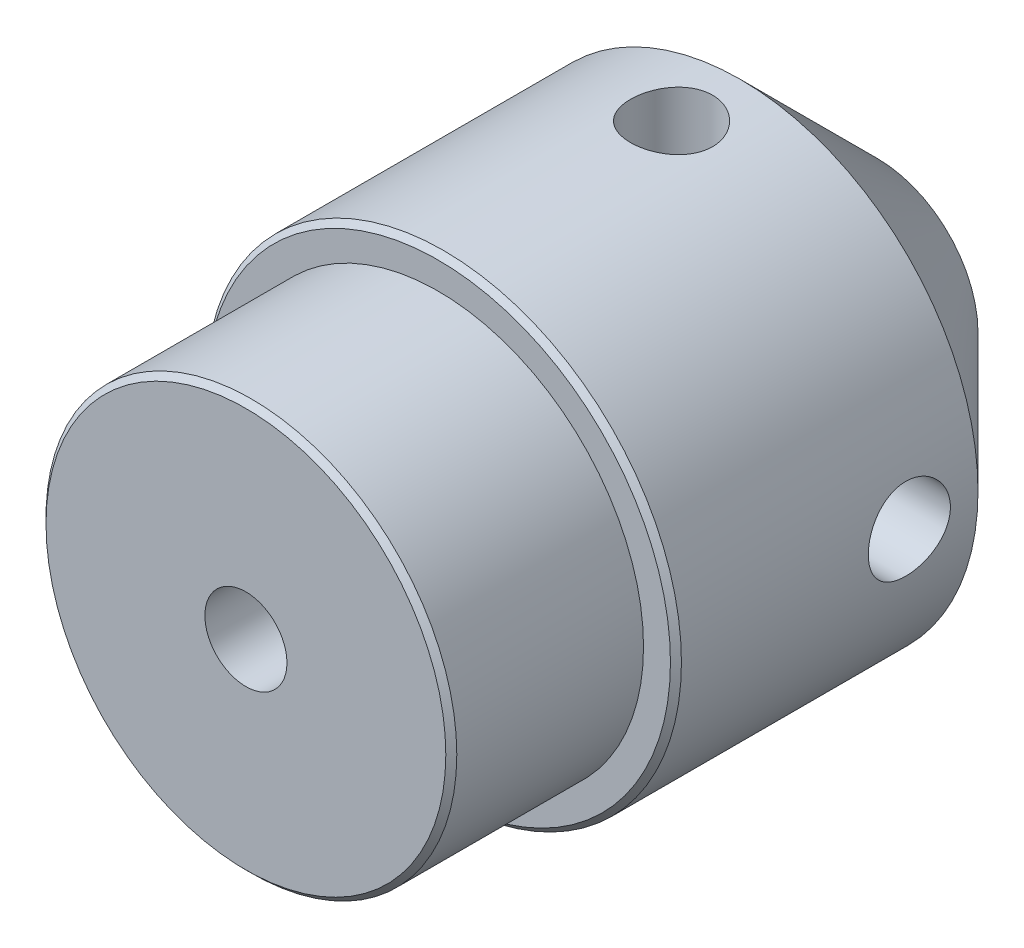
ISO-10303-21;
HEADER;
FILE_DESCRIPTION(('STEP AP214'),'2;1');
FILE_NAME('part.step','',(''),(''),'','','');
FILE_SCHEMA(('AUTOMOTIVE_DESIGN { 1 0 10303 214 1 1 1 1 }'));
ENDSEC;
DATA;
#1=APPLICATION_CONTEXT('core data for automotive mechanical design processes');
#2=APPLICATION_PROTOCOL_DEFINITION('international standard','automotive_design',2000,#1);
#3=PRODUCT_CONTEXT('',#1,'mechanical');
#4=PRODUCT('Part','Part','',(#3));
#5=PRODUCT_RELATED_PRODUCT_CATEGORY('part','',(#4));
#6=PRODUCT_DEFINITION_FORMATION('','',#4);
#7=PRODUCT_DEFINITION_CONTEXT('part definition',#1,'design');
#8=PRODUCT_DEFINITION('design','',#6,#7);
#9=PRODUCT_DEFINITION_SHAPE('','',#8);
#10=(LENGTH_UNIT() NAMED_UNIT(*) SI_UNIT(.MILLI.,.METRE.));
#11=(NAMED_UNIT(*) PLANE_ANGLE_UNIT() SI_UNIT($,.RADIAN.));
#12=(NAMED_UNIT(*) SI_UNIT($,.STERADIAN.) SOLID_ANGLE_UNIT());
#13=UNCERTAINTY_MEASURE_WITH_UNIT(LENGTH_MEASURE(1.E-05),#10,'distance_accuracy_value','');
#14=(GEOMETRIC_REPRESENTATION_CONTEXT(3) GLOBAL_UNCERTAINTY_ASSIGNED_CONTEXT((#13)) GLOBAL_UNIT_ASSIGNED_CONTEXT((#10,
#11,#12)) REPRESENTATION_CONTEXT('',''));
#15=CARTESIAN_POINT('',(0.,0.,0.));
#16=DIRECTION('',(0.,0.,1.));
#17=DIRECTION('',(1.,0.,0.));
#18=AXIS2_PLACEMENT_3D('',#15,#16,#17);
#19=CARTESIAN_POINT('',(0.,0.,20.32));
#20=DIRECTION('',(0.,0.,1.));
#21=DIRECTION('',(1.,0.,0.));
#22=AXIS2_PLACEMENT_3D('',#19,#20,#21);
#23=PLANE('',#22);
#24=CARTESIAN_POINT('',(0.,0.,20.32));
#25=DIRECTION('',(0.,0.,1.));
#26=DIRECTION('',(1.,0.,0.));
#27=AXIS2_PLACEMENT_3D('',#24,#25,#26);
#28=CIRCLE('',#27,10.746);
#29=CARTESIAN_POINT('',(10.746,0.,20.32));
#30=VERTEX_POINT('',#29);
#31=EDGE_CURVE('E39',#30,#30,#28,.T.);
#32=ORIENTED_EDGE('',*,*,#31,.T.);
#33=EDGE_LOOP('',(#32));
#34=FACE_BOUND('',#33,.T.);
#35=CARTESIAN_POINT('',(0.,0.,20.32));
#36=DIRECTION('',(0.,0.,1.));
#37=DIRECTION('',(1.,0.,0.));
#38=AXIS2_PLACEMENT_3D('',#35,#36,#37);
#39=CIRCLE('',#38,9.5);
#40=CARTESIAN_POINT('',(9.5,0.,20.32));
#41=VERTEX_POINT('',#40);
#42=EDGE_CURVE('E58',#41,#41,#39,.T.);
#43=ORIENTED_EDGE('',*,*,#42,.F.);
#44=EDGE_LOOP('',(#43));
#45=FACE_BOUND('',#44,.T.);
#46=ADVANCED_FACE('F32',(#34,#45),#23,.T.);
#47=CARTESIAN_POINT('',(0.,0.,20.32));
#48=DIRECTION('',(0.,0.,-1.));
#49=DIRECTION('',(-1.,0.,0.));
#50=AXIS2_PLACEMENT_3D('',#47,#48,#49);
#51=CYLINDRICAL_SURFACE('',#50,11.);
#52=CARTESIAN_POINT('',(11.,0.,7.62635));
#53=CARTESIAN_POINT('',(10.9999981523539,-0.105805442405319,7.62635419145079));
#54=CARTESIAN_POINT('',(10.99845757426,-0.211667228713869,7.63522415803058));
#55=CARTESIAN_POINT('',(10.9924602893102,-0.420417866640618,7.67045270552137));
#56=CARTESIAN_POINT('',(10.9880009611831,-0.523303959037818,7.69682700702448));
#57=CARTESIAN_POINT('',(10.9766659831166,-0.723053143678178,7.76624097869004));
#58=CARTESIAN_POINT('',(10.9697923668336,-0.819921224574908,7.80926662582083));
#59=CARTESIAN_POINT('',(10.9543831646584,-1.00505199771031,7.91072436106028));
#60=CARTESIAN_POINT('',(10.9458477535447,-1.09331559345729,7.96915482920385));
#61=CARTESIAN_POINT('',(10.9279624820465,-1.25964563765195,8.10039861813566));
#62=CARTESIAN_POINT('',(10.9186058827075,-1.33761136833188,8.17333867737932));
#63=CARTESIAN_POINT('',(10.9001839287852,-1.48026215108577,8.33125838424623));
#64=CARTESIAN_POINT('',(10.8911185932852,-1.54494633445972,8.41623881877474));
#65=CARTESIAN_POINT('',(10.8742402684905,-1.65960572921955,8.59652436669664));
#66=CARTESIAN_POINT('',(10.8664359825455,-1.7094805562732,8.69189420936576));
#67=CARTESIAN_POINT('',(10.8530573098417,-1.79246335200913,8.88981557628309));
#68=CARTESIAN_POINT('',(10.8474827611997,-1.82557253795546,8.99236657852992));
#69=CARTESIAN_POINT('',(10.8392620383863,-1.87376523193456,9.20066873320939));
#70=CARTESIAN_POINT('',(10.8365875540154,-1.88902312104116,9.30637840224324));
#71=CARTESIAN_POINT('',(10.8343842198333,-1.90162094158535,9.51888868799526));
#72=CARTESIAN_POINT('',(10.8348551312565,-1.89896223306347,9.62568922129192));
#73=CARTESIAN_POINT('',(10.838863553144,-1.87594419272278,9.83609970482532));
#74=CARTESIAN_POINT('',(10.8423670116831,-1.85578140368531,9.93973189953881));
#75=CARTESIAN_POINT('',(10.8519924245148,-1.7986362888669,10.1421201336787));
#76=CARTESIAN_POINT('',(10.8581144745335,-1.76165334820034,10.2408759946972));
#77=CARTESIAN_POINT('',(10.8723237297837,-1.67172041441955,10.4312929839028));
#78=CARTESIAN_POINT('',(10.8804208622865,-1.61868942511178,10.5229150867365));
#79=CARTESIAN_POINT('',(10.8976611408848,-1.49822319287714,10.6960346642193));
#80=CARTESIAN_POINT('',(10.9068043773447,-1.43078670514031,10.7775312629387));
#81=CARTESIAN_POINT('',(10.9252559375805,-1.28235594453461,10.9292235601322));
#82=CARTESIAN_POINT('',(10.9345648389951,-1.20119318034578,10.9992544243442));
#83=CARTESIAN_POINT('',(10.9521865522877,-1.02818196526628,11.1247289442071));
#84=CARTESIAN_POINT('',(10.9604993568536,-0.936333435945171,11.1801724927816));
#85=CARTESIAN_POINT('',(10.9752053448161,-0.744398317782369,11.274916062536));
#86=CARTESIAN_POINT('',(10.9815967113651,-0.644304045241601,11.3142008173418));
#87=CARTESIAN_POINT('',(10.9917252707792,-0.438803092895161,11.3753549546926));
#88=CARTESIAN_POINT('',(10.9954627019931,-0.33339689106291,11.3972259011872));
#89=CARTESIAN_POINT('',(10.999830045267,-0.121684177999061,11.4227065005));
#90=CARTESIAN_POINT('',(11.0004984408558,-0.0154056531345995,11.4265423157964));
#91=CARTESIAN_POINT('',(10.9987580523475,0.196275071000731,11.4164477374133));
#92=CARTESIAN_POINT('',(10.9963493955525,0.301677306343391,11.4025180787173));
#93=CARTESIAN_POINT('',(10.9887494020946,0.507909754965218,11.3574760635367));
#94=CARTESIAN_POINT('',(10.9835763144722,0.608765301198859,11.3264763524555));
#95=CARTESIAN_POINT('',(10.9710251223245,0.803847793222108,11.2482947799273));
#96=CARTESIAN_POINT('',(10.9636468866299,0.898074344285473,11.2011119558314));
#97=CARTESIAN_POINT('',(10.9474081660284,1.07820179854442,11.0913902998381));
#98=CARTESIAN_POINT('',(10.9385343761356,1.16401593600034,11.0287110343937));
#99=CARTESIAN_POINT('',(10.9203272673355,1.32398881832811,10.8899680401453));
#100=CARTESIAN_POINT('',(10.9109939125103,1.39814665028313,10.8139032639818));
#101=CARTESIAN_POINT('',(10.8927942708203,1.53354598421028,10.6495314147309));
#102=CARTESIAN_POINT('',(10.8839343522565,1.59463424643923,10.5610972942964));
#103=CARTESIAN_POINT('',(10.8678061208597,1.70108819343691,10.3750895706199));
#104=CARTESIAN_POINT('',(10.8605377549974,1.74645440208195,10.277516272043));
#105=CARTESIAN_POINT('',(10.8484639716268,1.81995050701225,10.0764176003192));
#106=CARTESIAN_POINT('',(10.8436479067203,1.84815502187113,9.97292016665764));
#107=CARTESIAN_POINT('',(10.836997937407,1.88676074836607,9.76256614223149));
#108=CARTESIAN_POINT('',(10.8351637529749,1.89716363173995,9.65570986785299));
#109=CARTESIAN_POINT('',(10.83469787987,1.89982160069711,9.44320285192229));
#110=CARTESIAN_POINT('',(10.8360236034201,1.89231801968301,9.33755514527822));
#111=CARTESIAN_POINT('',(10.841634534147,1.85989968383072,9.12904996663719));
#112=CARTESIAN_POINT('',(10.8459197296711,1.83498499754852,9.02619248365543));
#113=CARTESIAN_POINT('',(10.8569501018197,1.76854675674606,8.82629083515651));
#114=CARTESIAN_POINT('',(10.8636919817097,1.72704545335812,8.72923908091982));
#115=CARTESIAN_POINT('',(10.8788790186075,1.62863723565279,8.54343681220639));
#116=CARTESIAN_POINT('',(10.8873242700664,1.57172946699456,8.45468675845449));
#117=CARTESIAN_POINT('',(10.9051007380695,1.44326848308094,8.28679067632753));
#118=CARTESIAN_POINT('',(10.9144418556182,1.37153822550961,8.20778113466134));
#119=CARTESIAN_POINT('',(10.9328799449571,1.21584078350765,8.06283815124266));
#120=CARTESIAN_POINT('',(10.9419768600131,1.13187078412813,7.99690772573944));
#121=CARTESIAN_POINT('',(10.9589805425879,0.953330689244697,7.87954177466651));
#122=CARTESIAN_POINT('',(10.966877921604,0.858686163692946,7.8282180938953));
#123=CARTESIAN_POINT('',(10.9805013559036,0.662018583716496,7.74227843644626));
#124=CARTESIAN_POINT('',(10.98622953915,0.560002877989753,7.70764607657802));
#125=CARTESIAN_POINT('',(10.9936414363286,0.381346641752629,7.66345755174356));
#126=CARTESIAN_POINT('',(10.9960129577877,0.305777554853252,7.64956490768501));
#127=CARTESIAN_POINT('',(10.9991928947411,0.153482181095077,7.63100970043529));
#128=CARTESIAN_POINT('',(11.0000013403637,0.0767559165696393,7.62634695933745));
#129=CARTESIAN_POINT('',(11.,0.,7.62635));
#130=B_SPLINE_CURVE_WITH_KNOTS('',3,(#52,#53,#54,#55,#56,#57,#58,#59,#60,#61,#62,#63,#64,#65,
#66,#67,#68,#69,#70,#71,#72,#73,#74,#75,#76,#77,#78,#79,#80,#81,#82,#83,#84,#85,#86,#87,#88,#89,
#90,#91,#92,#93,#94,#95,#96,#97,#98,#99,#100,#101,#102,#103,#104,#105,#106,#107,#108,#109,#110,
#111,#112,#113,#114,#115,#116,#117,#118,#119,#120,#121,#122,#123,#124,#125,#126,#127,#128,#129),
.UNSPECIFIED.,.T.,.F.,(4,2,2,2,2,2,2,2,2,2,2,2,2,2,2,2,2,2,2,2,2,2,2,2,2,2,2,2,2,2,2,2,2,2,2,2,
2,2,4),(0.,0.317135725648765,0.634556656079107,0.951710848215271,1.26883170183184,
1.58885486149989,1.90889894611148,2.23106534512581,2.55320834999609,2.87217749562929,
3.19112242873707,3.50653177326038,3.8219526489674,4.13899281736057,4.45606039296368,
4.77734770630906,5.09863737795955,5.42022990168102,5.74179353963155,6.05931378396465,
6.37682089245084,6.69225745125109,7.00771277698102,7.3261389676855,7.64459008497916,
7.96659200166458,8.2885831878559,8.60916417027042,8.92971504551376,9.24597016493062,
9.56222403910429,9.87805507163056,10.1939036216494,10.5137688036741,10.8337076660905,
11.1560341759132,11.4780436619425,11.7081122855696,11.9381764745732),.UNSPECIFIED.);
#131=CARTESIAN_POINT('',(11.,0.,7.62635));
#132=VERTEX_POINT('',#131);
#133=EDGE_CURVE('E147',#132,#132,#130,.T.);
#134=ORIENTED_EDGE('',*,*,#133,.T.);
#135=EDGE_LOOP('',(#134));
#136=FACE_BOUND('',#135,.T.);
#137=CARTESIAN_POINT('',(0.,0.,20.066));
#138=DIRECTION('',(0.,0.,1.));
#139=DIRECTION('',(1.,0.,0.));
#140=AXIS2_PLACEMENT_3D('',#137,#138,#139);
#141=CIRCLE('',#140,11.);
#142=CARTESIAN_POINT('',(11.,0.,20.066));
#143=VERTEX_POINT('',#142);
#144=EDGE_CURVE('E10',#143,#143,#141,.F.);
#145=ORIENTED_EDGE('',*,*,#144,.T.);
#146=EDGE_LOOP('',(#145));
#147=FACE_BOUND('',#146,.T.);
#148=CARTESIAN_POINT('',(0.,0.,6.35));
#149=DIRECTION('',(0.,0.,1.));
#150=DIRECTION('',(1.,0.,0.));
#151=AXIS2_PLACEMENT_3D('',#148,#149,#150);
#152=CIRCLE('',#151,11.);
#153=CARTESIAN_POINT('',(11.,0.,6.35));
#154=VERTEX_POINT('',#153);
#155=EDGE_CURVE('E55',#154,#154,#152,.T.);
#156=ORIENTED_EDGE('',*,*,#155,.T.);
#157=EDGE_LOOP('',(#156));
#158=FACE_BOUND('',#157,.T.);
#159=CARTESIAN_POINT('',(0.,11.,11.42365));
#160=CARTESIAN_POINT('',(-0.105805442405319,10.9999981523539,11.4236458085492));
#161=CARTESIAN_POINT('',(-0.211667228713869,10.99845757426,11.4147758419694));
#162=CARTESIAN_POINT('',(-0.420417866640617,10.9924602893102,11.3795472944786));
#163=CARTESIAN_POINT('',(-0.523303959037817,10.9880009611831,11.3531729929755));
#164=CARTESIAN_POINT('',(-0.723053143678175,10.9766659831166,11.2837590213099));
#165=CARTESIAN_POINT('',(-0.819921224574905,10.9697923668336,11.2407333741792));
#166=CARTESIAN_POINT('',(-1.00505199771031,10.9543831646584,11.1392756389397));
#167=CARTESIAN_POINT('',(-1.09331559345729,10.9458477535448,11.0808451707961));
#168=CARTESIAN_POINT('',(-1.25964563765194,10.9279624820466,10.9496013818643));
#169=CARTESIAN_POINT('',(-1.33761136833187,10.9186058827075,10.8766613226207));
#170=CARTESIAN_POINT('',(-1.48026215108575,10.9001839287852,10.7187416157537));
#171=CARTESIAN_POINT('',(-1.5449463344597,10.8911185932852,10.6337611812252));
#172=CARTESIAN_POINT('',(-1.65960572921953,10.8742402684905,10.4534756333033));
#173=CARTESIAN_POINT('',(-1.70948055627318,10.8664359825455,10.3581057906342));
#174=CARTESIAN_POINT('',(-1.79246335200911,10.8530573098417,10.1601844237169));
#175=CARTESIAN_POINT('',(-1.82557253795543,10.8474827611997,10.05763342147));
#176=CARTESIAN_POINT('',(-1.87376523193452,10.8392620383863,9.84933126679057));
#177=CARTESIAN_POINT('',(-1.88902312104112,10.8365875540154,9.74362159775672));
#178=CARTESIAN_POINT('',(-1.90162094158531,10.8343842198333,9.53111131200471));
#179=CARTESIAN_POINT('',(-1.89896223306342,10.8348551312565,9.42431077870804));
#180=CARTESIAN_POINT('',(-1.87594419272273,10.838863553144,9.21390029517464));
#181=CARTESIAN_POINT('',(-1.85578140368526,10.8423670116831,9.11026810046115));
#182=CARTESIAN_POINT('',(-1.79863628886685,10.8519924245148,8.90787986632123));
#183=CARTESIAN_POINT('',(-1.76165334820028,10.8581144745335,8.80912400530274));
#184=CARTESIAN_POINT('',(-1.67172041441949,10.8723237297837,8.61870701609713));
#185=CARTESIAN_POINT('',(-1.61868942511172,10.8804208622865,8.52708491326348));
#186=CARTESIAN_POINT('',(-1.49822319287707,10.8976611408848,8.35396533578072));
#187=CARTESIAN_POINT('',(-1.43078670514025,10.9068043773447,8.27246873706125));
#188=CARTESIAN_POINT('',(-1.28235594453454,10.9252559375805,8.12077643986774));
#189=CARTESIAN_POINT('',(-1.20119318034571,10.9345648389951,8.05074557565577));
#190=CARTESIAN_POINT('',(-1.02818196526621,10.9521865522877,7.92527105579286));
#191=CARTESIAN_POINT('',(-0.936333435945093,10.9604993568536,7.86982750721836));
#192=CARTESIAN_POINT('',(-0.744398317782289,10.9752053448161,7.77508393746398));
#193=CARTESIAN_POINT('',(-0.644304045241521,10.9815967113651,7.73579918265818));
#194=CARTESIAN_POINT('',(-0.438803092895079,10.9917252707792,7.67464504530741));
#195=CARTESIAN_POINT('',(-0.333396891062827,10.9954627019931,7.65277409881276));
#196=CARTESIAN_POINT('',(-0.121684177998978,10.999830045267,7.62729349949999));
#197=CARTESIAN_POINT('',(-0.0154056531345164,11.0004984408558,7.62345768420362));
#198=CARTESIAN_POINT('',(0.196275071000814,10.9987580523475,7.63355226258671));
#199=CARTESIAN_POINT('',(0.301677306343473,10.9963493955525,7.64748192128274));
#200=CARTESIAN_POINT('',(0.507909754965299,10.9887494020946,7.69252393646334));
#201=CARTESIAN_POINT('',(0.608765301198939,10.9835763144722,7.72352364754451));
#202=CARTESIAN_POINT('',(0.803847793222186,10.9710251223245,7.80170522007271));
#203=CARTESIAN_POINT('',(0.89807434428555,10.9636468866299,7.84888804416867));
#204=CARTESIAN_POINT('',(1.0782017985445,10.9474081660284,7.95860970016195));
#205=CARTESIAN_POINT('',(1.16401593600042,10.9385343761356,8.02128896560634));
#206=CARTESIAN_POINT('',(1.32398881832819,10.9203272673355,8.16003195985468));
#207=CARTESIAN_POINT('',(1.3981466502832,10.9109939125103,8.23609673601821));
#208=CARTESIAN_POINT('',(1.53354598421034,10.8927942708203,8.40046858526917));
#209=CARTESIAN_POINT('',(1.59463424643929,10.8839343522565,8.4889027057036));
#210=CARTESIAN_POINT('',(1.70108819343697,10.8678061208597,8.67491042938013));
#211=CARTESIAN_POINT('',(1.74645440208201,10.8605377549974,8.77248372795701));
#212=CARTESIAN_POINT('',(1.8199505070123,10.8484639716267,8.97358239968084));
#213=CARTESIAN_POINT('',(1.84815502187118,10.8436479067203,9.07707983334241));
#214=CARTESIAN_POINT('',(1.88676074836612,10.836997937407,9.28743385776855));
#215=CARTESIAN_POINT('',(1.89716363173999,10.8351637529749,9.39429013214706));
#216=CARTESIAN_POINT('',(1.89982160069715,10.83469787987,9.60679714807775));
#217=CARTESIAN_POINT('',(1.89231801968304,10.8360236034201,9.71244485472182));
#218=CARTESIAN_POINT('',(1.85989968383075,10.841634534147,9.92095003336285));
#219=CARTESIAN_POINT('',(1.83498499754855,10.845919729671,10.0238075163446));
#220=CARTESIAN_POINT('',(1.76854675674609,10.8569501018197,10.2237091648435));
#221=CARTESIAN_POINT('',(1.72704545335814,10.8636919817097,10.3207609190802));
#222=CARTESIAN_POINT('',(1.62863723565281,10.8788790186075,10.5065631877936));
#223=CARTESIAN_POINT('',(1.57172946699458,10.8873242700664,10.5953132415455));
#224=CARTESIAN_POINT('',(1.44326848308095,10.9051007380695,10.7632093236725));
#225=CARTESIAN_POINT('',(1.37153822550962,10.9144418556182,10.8422188653387));
#226=CARTESIAN_POINT('',(1.21584078350766,10.9328799449571,10.9871618487574));
#227=CARTESIAN_POINT('',(1.13187078412814,10.9419768600131,11.0530922742606));
#228=CARTESIAN_POINT('',(0.953330689244703,10.9589805425879,11.1704582253335));
#229=CARTESIAN_POINT('',(0.85868616369295,10.966877921604,11.2217819061047));
#230=CARTESIAN_POINT('',(0.662018583716497,10.9805013559036,11.3077215635538));
#231=CARTESIAN_POINT('',(0.560002877989754,10.98622953915,11.342353923422));
#232=CARTESIAN_POINT('',(0.381346641752628,10.9936414363286,11.3865424482564));
#233=CARTESIAN_POINT('',(0.305777554853251,10.9960129577877,11.400435092315));
#234=CARTESIAN_POINT('',(0.153482181095076,10.9991928947411,11.4189902995647));
#235=CARTESIAN_POINT('',(0.0767559165696389,11.0000013403637,11.4236530406626));
#236=CARTESIAN_POINT('',(0.,11.,11.42365));
#237=B_SPLINE_CURVE_WITH_KNOTS('',3,(#159,#160,#161,#162,#163,#164,#165,#166,#167,#168,#169,
#170,#171,#172,#173,#174,#175,#176,#177,#178,#179,#180,#181,#182,#183,#184,#185,#186,#187,#188,
#189,#190,#191,#192,#193,#194,#195,#196,#197,#198,#199,#200,#201,#202,#203,#204,#205,#206,#207,
#208,#209,#210,#211,#212,#213,#214,#215,#216,#217,#218,#219,#220,#221,#222,#223,#224,#225,#226,
#227,#228,#229,#230,#231,#232,#233,#234,#235,#236),.UNSPECIFIED.,.T.,.F.,(4,2,2,2,2,2,2,2,2,2,2,
2,2,2,2,2,2,2,2,2,2,2,2,2,2,2,2,2,2,2,2,2,2,2,2,2,2,2,4),(0.,0.317135725648765,
0.634556656079107,0.951710848215272,1.26883170183184,1.58885486149989,1.90889894611149,
2.23106534512581,2.55320834999609,2.87217749562929,3.19112242873707,3.50653177326038,
3.8219526489674,4.13899281736058,4.45606039296369,4.77734770630907,5.09863737795955,
5.42022990168102,5.74179353963155,6.05931378396466,6.37682089245084,6.69225745125109,
7.00771277698103,7.3261389676855,7.64459008497917,7.96659200166459,8.2885831878559,
8.60916417027043,8.92971504551377,9.24597016493062,9.56222403910429,9.87805507163056,
10.1939036216494,10.5137688036741,10.8337076660905,11.1560341759132,11.4780436619425,
11.7081122855696,11.9381764745732),.UNSPECIFIED.);
#238=CARTESIAN_POINT('',(0.,11.,11.42365));
#239=VERTEX_POINT('',#238);
#240=EDGE_CURVE('E67',#239,#239,#237,.T.);
#241=ORIENTED_EDGE('',*,*,#240,.T.);
#242=EDGE_LOOP('',(#241));
#243=FACE_BOUND('',#242,.T.);
#244=ADVANCED_FACE('F79',(#136,#147,#158,#243),#51,.T.);
#245=CARTESIAN_POINT('',(0.,0.,0.));
#246=DIRECTION('',(0.,0.,1.));
#247=DIRECTION('',(1.,0.,0.));
#248=AXIS2_PLACEMENT_3D('',#245,#246,#247);
#249=PLANE('',#248);
#250=CARTESIAN_POINT('',(0.,0.,0.));
#251=DIRECTION('',(0.,0.,1.));
#252=DIRECTION('',(1.,0.,0.));
#253=AXIS2_PLACEMENT_3D('',#250,#251,#252);
#254=CIRCLE('',#253,4.64999999999997);
#255=CARTESIAN_POINT('',(4.64999999999997,0.,0.));
#256=VERTEX_POINT('',#255);
#257=EDGE_CURVE('E52',#256,#256,#254,.F.);
#258=ORIENTED_EDGE('',*,*,#257,.T.);
#259=EDGE_LOOP('',(#258));
#260=FACE_BOUND('',#259,.T.);
#261=CARTESIAN_POINT('',(0.,0.,0.));
#262=DIRECTION('',(0.,0.,-1.));
#263=DIRECTION('',(-1.,0.,0.));
#264=AXIS2_PLACEMENT_3D('',#261,#262,#263);
#265=CIRCLE('',#264,3.02259999999998);
#266=CARTESIAN_POINT('',(-3.02259999999998,0.,0.));
#267=VERTEX_POINT('',#266);
#268=EDGE_CURVE('E64',#267,#267,#265,.T.);
#269=ORIENTED_EDGE('',*,*,#268,.F.);
#270=EDGE_LOOP('',(#269));
#271=FACE_BOUND('',#270,.T.);
#272=ADVANCED_FACE('F108',(#260,#271),#249,.F.);
#273=CARTESIAN_POINT('',(0.,0.,29.21));
#274=DIRECTION('',(0.,0.,-1.));
#275=DIRECTION('',(-1.,0.,0.));
#276=AXIS2_PLACEMENT_3D('',#273,#274,#275);
#277=CYLINDRICAL_SURFACE('',#276,9.5);
#278=CARTESIAN_POINT('',(0.,0.,28.956));
#279=DIRECTION('',(0.,0.,1.));
#280=DIRECTION('',(1.,0.,0.));
#281=AXIS2_PLACEMENT_3D('',#278,#279,#280);
#282=CIRCLE('',#281,9.5);
#283=CARTESIAN_POINT('',(9.5,0.,28.956));
#284=VERTEX_POINT('',#283);
#285=EDGE_CURVE('E43',#284,#284,#282,.F.);
#286=ORIENTED_EDGE('',*,*,#285,.T.);
#287=EDGE_LOOP('',(#286));
#288=FACE_BOUND('',#287,.T.);
#289=ORIENTED_EDGE('',*,*,#42,.T.);
#290=EDGE_LOOP('',(#289));
#291=FACE_BOUND('',#290,.T.);
#292=ADVANCED_FACE('F104',(#288,#291),#277,.T.);
#293=CARTESIAN_POINT('',(0.,0.,29.21));
#294=DIRECTION('',(0.,0.,1.));
#295=DIRECTION('',(1.,0.,0.));
#296=AXIS2_PLACEMENT_3D('',#293,#294,#295);
#297=PLANE('',#296);
#298=CARTESIAN_POINT('',(0.,0.,29.21));
#299=DIRECTION('',(0.,0.,1.));
#300=DIRECTION('',(1.,0.,0.));
#301=AXIS2_PLACEMENT_3D('',#298,#299,#300);
#302=CIRCLE('',#301,9.246);
#303=CARTESIAN_POINT('',(9.246,0.,29.21));
#304=VERTEX_POINT('',#303);
#305=EDGE_CURVE('E47',#304,#304,#302,.T.);
#306=ORIENTED_EDGE('',*,*,#305,.T.);
#307=EDGE_LOOP('',(#306));
#308=FACE_BOUND('',#307,.T.);
#309=CARTESIAN_POINT('',(0.,0.,29.21));
#310=DIRECTION('',(0.,0.,1.));
#311=DIRECTION('',(1.,0.,0.));
#312=AXIS2_PLACEMENT_3D('',#309,#310,#311);
#313=CIRCLE('',#312,1.89865);
#314=CARTESIAN_POINT('',(1.89865,0.,29.21));
#315=VERTEX_POINT('',#314);
#316=EDGE_CURVE('E145',#315,#315,#313,.T.);
#317=ORIENTED_EDGE('',*,*,#316,.F.);
#318=EDGE_LOOP('',(#317));
#319=FACE_BOUND('',#318,.T.);
#320=ADVANCED_FACE('F100',(#308,#319),#297,.T.);
#321=CARTESIAN_POINT('',(0.,0.,19.05));
#322=DIRECTION('',(0.,0.,-1.));
#323=DIRECTION('',(-1.,0.,0.));
#324=AXIS2_PLACEMENT_3D('',#321,#322,#323);
#325=CONICAL_SURFACE('',#324,3.02259999999998,1.02974425867665);
#326=CARTESIAN_POINT('',(0.,0.,19.725337292756));
#327=DIRECTION('',(0.,0.,-1.));
#328=DIRECTION('',(-1.,0.,0.));
#329=AXIS2_PLACEMENT_3D('',#326,#327,#328);
#330=CIRCLE('',#329,1.89865);
#331=CARTESIAN_POINT('',(-1.89865,0.,19.725337292756));
#332=VERTEX_POINT('',#331);
#333=EDGE_CURVE('E142',#332,#332,#330,.F.);
#334=ORIENTED_EDGE('',*,*,#333,.T.);
#335=EDGE_LOOP('',(#334));
#336=FACE_BOUND('',#335,.T.);
#337=CARTESIAN_POINT('',(0.,0.,19.05));
#338=DIRECTION('',(0.,0.,-1.));
#339=DIRECTION('',(-1.,0.,0.));
#340=AXIS2_PLACEMENT_3D('',#337,#338,#339);
#341=CIRCLE('',#340,3.02259999999998);
#342=CARTESIAN_POINT('',(-3.02259999999998,0.,19.05));
#343=VERTEX_POINT('',#342);
#344=EDGE_CURVE('E61',#343,#343,#341,.T.);
#345=ORIENTED_EDGE('',*,*,#344,.T.);
#346=EDGE_LOOP('',(#345));
#347=FACE_BOUND('',#346,.T.);
#348=ADVANCED_FACE('F96',(#336,#347),#325,.F.);
#349=CARTESIAN_POINT('',(0.,0.,0.));
#350=DIRECTION('',(0.,0.,-1.));
#351=DIRECTION('',(-1.,0.,0.));
#352=AXIS2_PLACEMENT_3D('',#349,#350,#351);
#353=CYLINDRICAL_SURFACE('',#352,3.02259999999998);
#354=CARTESIAN_POINT('',(3.02259999999998,0.,7.62635));
#355=CARTESIAN_POINT('',(3.02259269615651,0.0963812552155995,7.62635795848111));
#356=CARTESIAN_POINT('',(3.01794168894506,0.1928764303467,7.63373899004385));
#357=CARTESIAN_POINT('',(2.99977609579035,0.382897701977104,7.66286633824407));
#358=CARTESIAN_POINT('',(2.98624526399484,0.476418026480851,7.68463898521456));
#359=CARTESIAN_POINT('',(2.95168023540514,0.657373834330388,7.74127443886395));
#360=CARTESIAN_POINT('',(2.93068317373823,0.744836917592463,7.77607250475342));
#361=CARTESIAN_POINT('',(2.88292929889071,0.912375517847491,7.85733061650928));
#362=CARTESIAN_POINT('',(2.85617302952692,0.992451731331113,7.90378956135855));
#363=CARTESIAN_POINT('',(2.79656759469634,1.15021215197412,8.01116123234067));
#364=CARTESIAN_POINT('',(2.7634017546365,1.22718843578583,8.07293479936781));
#365=CARTESIAN_POINT('',(2.69527138405428,1.37037400763602,8.20719937756659));
#366=CARTESIAN_POINT('',(2.66030446528579,1.43656848852879,8.27970487101912));
#367=CARTESIAN_POINT('',(2.58677220843688,1.56555025319507,8.44500942940552));
#368=CARTESIAN_POINT('',(2.54837070746585,1.6266264513156,8.53922789502701));
#369=CARTESIAN_POINT('',(2.47803108819243,1.73190417638352,8.7388354612274));
#370=CARTESIAN_POINT('',(2.44608205792669,1.77613430638592,8.84420523557202));
#371=CARTESIAN_POINT('',(2.40104028999718,1.83633994990677,9.0351434809511));
#372=CARTESIAN_POINT('',(2.38520131846805,1.85667963282384,9.11868358457992));
#373=CARTESIAN_POINT('',(2.3621873251808,1.88587885993094,9.28886542108322));
#374=CARTESIAN_POINT('',(2.35499987437802,1.89475487452649,9.37550251988915));
#375=CARTESIAN_POINT('',(2.35037310138545,1.90049323594062,9.5496811443369));
#376=CARTESIAN_POINT('',(2.35296025658584,1.89732295168899,9.63722448502274));
#377=CARTESIAN_POINT('',(2.36752455960893,1.87911268583941,9.81029429913022));
#378=CARTESIAN_POINT('',(2.37950928424152,1.86406312648608,9.89581908775024));
#379=CARTESIAN_POINT('',(2.41074654882284,1.82346899059582,10.0606013129247));
#380=CARTESIAN_POINT('',(2.42981586117396,1.79818767579278,10.1399604213718));
#381=CARTESIAN_POINT('',(2.47312512999632,1.73813989529535,10.2934681479727));
#382=CARTESIAN_POINT('',(2.49736690794847,1.70337008702678,10.3676149183439));
#383=CARTESIAN_POINT('',(2.55379769233046,1.61781260322057,10.5234356708736));
#384=CARTESIAN_POINT('',(2.58662369879015,1.56524177830011,10.6038993078034));
#385=CARTESIAN_POINT('',(2.65355121775275,1.44889324102437,10.7557494528961));
#386=CARTESIAN_POINT('',(2.68765402147671,1.38510392853395,10.8271264322889));
#387=CARTESIAN_POINT('',(2.76003475425027,1.23544825890867,10.9710459693458));
#388=CARTESIAN_POINT('',(2.79804827948732,1.14767306918582,11.0417594465368));
#389=CARTESIAN_POINT('',(2.86809283701309,0.959288703104611,11.1673859118996));
#390=CARTESIAN_POINT('',(2.90012608582626,0.858684305114937,11.2223047582754));
#391=CARTESIAN_POINT('',(2.95314134349875,0.652519717827698,11.3113410006909));
#392=CARTESIAN_POINT('',(2.97461648017451,0.547499484387609,11.3464015072686));
#393=CARTESIAN_POINT('',(3.00635286086979,0.331391264557693,11.3977883186541));
#394=CARTESIAN_POINT('',(3.01663030927923,0.220312291155992,11.4141416966239));
#395=CARTESIAN_POINT('',(3.02407210139889,0.0134132623024651,11.4259947153844));
#396=CARTESIAN_POINT('',(3.02297175334734,-0.0821971009533215,11.4242538060829));
#397=CARTESIAN_POINT('',(3.01186912156235,-0.271552324886226,11.4065329685095));
#398=CARTESIAN_POINT('',(3.00186750971635,-0.365297325819081,11.3905541149496));
#399=CARTESIAN_POINT('',(2.97449092620117,-0.544425664027164,11.3461660133127));
#400=CARTESIAN_POINT('',(2.95743638730434,-0.629994349783819,11.3182954726154));
#401=CARTESIAN_POINT('',(2.91737639850923,-0.795143459143201,11.2514303004803));
#402=CARTESIAN_POINT('',(2.89436997071895,-0.874722895939482,11.212433840952));
#403=CARTESIAN_POINT('',(2.84148959294259,-1.03431422038713,11.1201174499387));
#404=CARTESIAN_POINT('',(2.81115805362271,-1.11356736248057,11.0657525365269));
#405=CARTESIAN_POINT('',(2.74755959177671,-1.26237481022523,10.9464064920518));
#406=CARTESIAN_POINT('',(2.71428945958073,-1.33191829119644,10.8814136850794));
#407=CARTESIAN_POINT('',(2.64240518654857,-1.46993399332965,10.7316522641639));
#408=CARTESIAN_POINT('',(2.60372389275429,-1.53674848713595,10.6453811150833));
#409=CARTESIAN_POINT('',(2.53007332801949,-1.65520532407201,10.4615384697271));
#410=CARTESIAN_POINT('',(2.49510168993214,-1.70685738006537,10.3639742637426));
#411=CARTESIAN_POINT('',(2.44023536995215,-1.78413197632448,10.180354734374));
#412=CARTESIAN_POINT('',(2.41871762946998,-1.81293454047727,10.0961301672942));
#413=CARTESIAN_POINT('',(2.38378766013322,-1.85862997004287,9.92294227951606));
#414=CARTESIAN_POINT('',(2.37036263353379,-1.87554164668416,9.83398668417738));
#415=CARTESIAN_POINT('',(2.3536131714425,-1.89652619631622,9.65303921792148));
#416=CARTESIAN_POINT('',(2.35034934473001,-1.90052203524942,9.5610324236731));
#417=CARTESIAN_POINT('',(2.35468484824969,-1.89514605889651,9.37765266019607));
#418=CARTESIAN_POINT('',(2.36228736391417,-1.88577032377947,9.28627988471908));
#419=CARTESIAN_POINT('',(2.38597671858273,-1.85567827656938,9.11479342103727));
#420=CARTESIAN_POINT('',(2.40128839679289,-1.83599241639018,9.03438247080969));
#421=CARTESIAN_POINT('',(2.43802576642573,-1.78691822019538,8.87807376492106));
#422=CARTESIAN_POINT('',(2.4594540663976,-1.75752574376838,8.80217795154898));
#423=CARTESIAN_POINT('',(2.50973885484694,-1.68508915302304,8.64531652435028));
#424=CARTESIAN_POINT('',(2.53921946236316,-1.64069359678627,8.56517888871862));
#425=CARTESIAN_POINT('',(2.60068017413299,-1.5414243739126,8.41271770425267));
#426=CARTESIAN_POINT('',(2.63266226628211,-1.48654232279033,8.34040048118486));
#427=CARTESIAN_POINT('',(2.70313622097728,-1.35491520950846,8.19048465367524));
#428=CARTESIAN_POINT('',(2.7416350740664,-1.27599338191692,8.11478117913062));
#429=CARTESIAN_POINT('',(2.81483693526265,-1.10519579028053,7.97727605075107));
#430=CARTESIAN_POINT('',(2.84953744315275,-1.01331158388134,7.91548352570163));
#431=CARTESIAN_POINT('',(2.91177860871444,-0.81744783369288,7.80768509134805));
#432=CARTESIAN_POINT('',(2.93927265725108,-0.713395556502325,7.76178136242101));
#433=CARTESIAN_POINT('',(2.97243816159597,-0.551169706187052,7.70721342435385));
#434=CARTESIAN_POINT('',(2.98214218818244,-0.496123176982516,7.69141335534211));
#435=CARTESIAN_POINT('',(2.99858391323828,-0.38442117537922,7.6647906370088));
#436=CARTESIAN_POINT('',(3.00532376194814,-0.327766901117267,7.65396437938583));
#437=CARTESIAN_POINT('',(3.01447898123123,-0.225924238864938,7.6392987772999));
#438=CARTESIAN_POINT('',(3.01751733032142,-0.180933966758207,7.63444989841867));
#439=CARTESIAN_POINT('',(3.02157961839751,-0.0906375426504711,7.62797354053662));
#440=CARTESIAN_POINT('',(3.02260343524516,-0.045331371664069,7.62634625685654));
#441=CARTESIAN_POINT('',(3.02259999999998,0.,7.62635));
#442=B_SPLINE_CURVE_WITH_KNOTS('',3,(#354,#355,#356,#357,#358,#359,#360,#361,#362,#363,#364,
#365,#366,#367,#368,#369,#370,#371,#372,#373,#374,#375,#376,#377,#378,#379,#380,#381,#382,#383,
#384,#385,#386,#387,#388,#389,#390,#391,#392,#393,#394,#395,#396,#397,#398,#399,#400,#401,#402,
#403,#404,#405,#406,#407,#408,#409,#410,#411,#412,#413,#414,#415,#416,#417,#418,#419,#420,#421,
#422,#423,#424,#425,#426,#427,#428,#429,#430,#431,#432,#433,#434,#435,#436,#437,#438,#439,#440,
#441),.UNSPECIFIED.,.T.,.F.,(4,2,2,2,2,2,2,2,2,2,2,2,2,2,2,2,2,2,2,2,2,2,2,2,2,2,2,2,2,2,2,2,2,
2,2,2,2,2,2,2,2,2,2,4),(0.,0.288961515808568,0.578453172985157,0.866524661914142,
1.15456896143469,1.46573389874182,1.7773226342763,2.13162643205554,2.48532594435193,
2.74652315775547,3.00734467751215,3.26887321483226,3.53061282715783,3.78600741113161,
4.04149208104037,4.34506829356923,4.64896027549613,5.00404381288205,5.3589954799907,
5.69525538578425,6.03102803442989,6.31644867415331,6.60184777151137,6.87549980388449,
7.14919682571842,7.45037285546047,7.75188201095148,8.09767778656981,8.44325156401875,
8.71690339484734,8.99012133205158,9.26496584751833,9.53989094927216,9.79147370802717,
10.0431639197253,10.3308604449351,10.6187879680451,10.9650106370355,11.311459849778,
11.6600973840866,11.8340970838557,12.0079703536917,12.1438705112253,12.2797789079401),.UNSPECIFIED.);
#443=CARTESIAN_POINT('',(3.02259999999998,0.,7.62635));
#444=VERTEX_POINT('',#443);
#445=EDGE_CURVE('E150',#444,#444,#442,.T.);
#446=ORIENTED_EDGE('',*,*,#445,.T.);
#447=EDGE_LOOP('',(#446));
#448=FACE_BOUND('',#447,.T.);
#449=CARTESIAN_POINT('',(0.,3.02259999999998,11.42365));
#450=CARTESIAN_POINT('',(0.0963812552156408,3.0225926961565,11.4236420415189));
#451=CARTESIAN_POINT('',(0.192876430346742,3.01794168894506,11.4162610099561));
#452=CARTESIAN_POINT('',(0.382897701977146,2.99977609579034,11.3871336617559));
#453=CARTESIAN_POINT('',(0.476418026480893,2.98624526399483,11.3653610147854));
#454=CARTESIAN_POINT('',(0.65737383433043,2.95168023540513,11.3087255611361));
#455=CARTESIAN_POINT('',(0.744836917592506,2.93068317373822,11.2739274952466));
#456=CARTESIAN_POINT('',(0.912375517847533,2.8829292988907,11.1926693834907));
#457=CARTESIAN_POINT('',(0.992451731331156,2.8561730295269,11.1462104386414));
#458=CARTESIAN_POINT('',(1.15021215197416,2.79656759469632,11.0388387676593));
#459=CARTESIAN_POINT('',(1.22718843578588,2.76340175463648,10.9770652006322));
#460=CARTESIAN_POINT('',(1.37037400763607,2.69527138405425,10.8428006224334));
#461=CARTESIAN_POINT('',(1.43656848852884,2.66030446528577,10.7702951289809));
#462=CARTESIAN_POINT('',(1.56555025319511,2.58677220843685,10.6049905705945));
#463=CARTESIAN_POINT('',(1.62662645131565,2.54837070746582,10.510772104973));
#464=CARTESIAN_POINT('',(1.73190417638356,2.4780310881924,10.3111645387726));
#465=CARTESIAN_POINT('',(1.77613430638597,2.44608205792665,10.205794764428));
#466=CARTESIAN_POINT('',(1.83633994990681,2.40104028999714,10.0148565190489));
#467=CARTESIAN_POINT('',(1.85667963282389,2.38520131846802,9.93131641542008));
#468=CARTESIAN_POINT('',(1.88587885993098,2.36218732518077,9.76113457891678));
#469=CARTESIAN_POINT('',(1.89475487452653,2.35499987437799,9.67449748011085));
#470=CARTESIAN_POINT('',(1.90049323594066,2.35037310138542,9.5003188556631));
#471=CARTESIAN_POINT('',(1.89732295168903,2.35296025658581,9.41277551497726));
#472=CARTESIAN_POINT('',(1.87911268583946,2.36752455960889,9.23970570086978));
#473=CARTESIAN_POINT('',(1.86406312648612,2.37950928424149,9.15418091224977));
#474=CARTESIAN_POINT('',(1.82346899059586,2.41074654882281,8.98939868707535));
#475=CARTESIAN_POINT('',(1.79818767579282,2.42981586117392,8.91003957862818));
#476=CARTESIAN_POINT('',(1.7381398952954,2.47312512999628,8.75653185202735));
#477=CARTESIAN_POINT('',(1.70337008702683,2.49736690794843,8.6823850816561));
#478=CARTESIAN_POINT('',(1.61781260322063,2.55379769233043,8.52656432912637));
#479=CARTESIAN_POINT('',(1.56524177830016,2.58662369879012,8.44610069219662));
#480=CARTESIAN_POINT('',(1.44889324102442,2.65355121775273,8.2942505471039));
#481=CARTESIAN_POINT('',(1.38510392853401,2.68765402147668,8.2228735677111));
#482=CARTESIAN_POINT('',(1.23544825890872,2.76003475425025,8.07895403065423));
#483=CARTESIAN_POINT('',(1.14767306918588,2.7980482794873,8.00824055346323));
#484=CARTESIAN_POINT('',(0.959288703104671,2.86809283701307,7.88261408810038));
#485=CARTESIAN_POINT('',(0.858684305114998,2.90012608582624,7.82769524172463));
#486=CARTESIAN_POINT('',(0.652519717827759,2.95314134349873,7.73865899930907));
#487=CARTESIAN_POINT('',(0.54749948438767,2.9746164801745,7.70359849273137));
#488=CARTESIAN_POINT('',(0.331391264557752,3.00635286086979,7.65221168134589));
#489=CARTESIAN_POINT('',(0.220312291156049,3.01663030927923,7.63585830337606));
#490=CARTESIAN_POINT('',(0.0134132623025206,3.02407210139889,7.62400528461562));
#491=CARTESIAN_POINT('',(-0.0821971009532668,3.02297175334734,7.62574619391713));
#492=CARTESIAN_POINT('',(-0.271552324886173,3.01186912156236,7.64346703149053));
#493=CARTESIAN_POINT('',(-0.36529732581903,3.00186750971636,7.65944588505044));
#494=CARTESIAN_POINT('',(-0.544425664027114,2.97449092620118,7.70383398668726));
#495=CARTESIAN_POINT('',(-0.629994349783769,2.95743638730435,7.73170452738456));
#496=CARTESIAN_POINT('',(-0.795143459143151,2.91737639850924,7.79856969951965));
#497=CARTESIAN_POINT('',(-0.874722895939433,2.89436997071897,7.83756615904803));
#498=CARTESIAN_POINT('',(-1.03431422038708,2.8414895929426,7.92988255006132));
#499=CARTESIAN_POINT('',(-1.11356736248052,2.81115805362273,7.98424746347307));
#500=CARTESIAN_POINT('',(-1.26237481022518,2.74755959177673,8.10359350794824));
#501=CARTESIAN_POINT('',(-1.33191829119639,2.71428945958075,8.16858631492061));
#502=CARTESIAN_POINT('',(-1.4699339933296,2.6424051865486,8.31834773583611));
#503=CARTESIAN_POINT('',(-1.5367484871359,2.60372389275432,8.40461888491672));
#504=CARTESIAN_POINT('',(-1.65520532407196,2.53007332801952,8.5884615302729));
#505=CARTESIAN_POINT('',(-1.70685738006532,2.49510168993217,8.68602573625742));
#506=CARTESIAN_POINT('',(-1.78413197632443,2.44023536995218,8.86964526562596));
#507=CARTESIAN_POINT('',(-1.81293454047722,2.41871762947001,8.95386983270583));
#508=CARTESIAN_POINT('',(-1.85862997004283,2.38378766013325,9.12705772048393));
#509=CARTESIAN_POINT('',(-1.87554164668411,2.37036263353383,9.21601331582261));
#510=CARTESIAN_POINT('',(-1.89652619631618,2.35361317144253,9.39696078207851));
#511=CARTESIAN_POINT('',(-1.90052203524938,2.35034934473005,9.48896757632689));
#512=CARTESIAN_POINT('',(-1.89514605889647,2.35468484824972,9.67234733980393));
#513=CARTESIAN_POINT('',(-1.88577032377943,2.36228736391421,9.76372011528092));
#514=CARTESIAN_POINT('',(-1.85567827656934,2.38597671858276,9.93520657896273));
#515=CARTESIAN_POINT('',(-1.83599241639014,2.40128839679292,10.0156175291903));
#516=CARTESIAN_POINT('',(-1.78691822019534,2.43802576642576,10.1719262350789));
#517=CARTESIAN_POINT('',(-1.75752574376834,2.45945406639763,10.247822048451));
#518=CARTESIAN_POINT('',(-1.685089153023,2.50973885484697,10.4046834756497));
#519=CARTESIAN_POINT('',(-1.64069359678623,2.53921946236319,10.4848211112814));
#520=CARTESIAN_POINT('',(-1.54142437391256,2.60068017413302,10.6372822957473));
#521=CARTESIAN_POINT('',(-1.48654232279028,2.63266226628213,10.7095995188152));
#522=CARTESIAN_POINT('',(-1.35491520950841,2.70313622097731,10.8595153463248));
#523=CARTESIAN_POINT('',(-1.27599338191688,2.74163507406643,10.9352188208694));
#524=CARTESIAN_POINT('',(-1.10519579028048,2.81483693526267,11.0727239492489));
#525=CARTESIAN_POINT('',(-1.01331158388129,2.84953744315277,11.1345164742984));
#526=CARTESIAN_POINT('',(-0.817447833692829,2.91177860871445,11.242314908652));
#527=CARTESIAN_POINT('',(-0.713395556502275,2.9392726572511,11.288218637579));
#528=CARTESIAN_POINT('',(-0.551169706187003,2.97243816159598,11.3427865756462));
#529=CARTESIAN_POINT('',(-0.496123176982467,2.98214218818245,11.3585866446579));
#530=CARTESIAN_POINT('',(-0.384421175379173,2.99858391323828,11.3852093629912));
#531=CARTESIAN_POINT('',(-0.32776690111722,3.00532376194815,11.3960356206142));
#532=CARTESIAN_POINT('',(-0.225924238864893,3.01447898123124,11.4107012227001));
#533=CARTESIAN_POINT('',(-0.180933966758163,3.01751733032143,11.4155501015813));
#534=CARTESIAN_POINT('',(-0.0906375426504285,3.02157961839751,11.4220264594634));
#535=CARTESIAN_POINT('',(-0.0453313716640274,3.02260343524516,11.4236537431435));
#536=CARTESIAN_POINT('',(0.,3.02259999999998,11.42365));
#537=B_SPLINE_CURVE_WITH_KNOTS('',3,(#449,#450,#451,#452,#453,#454,#455,#456,#457,#458,#459,
#460,#461,#462,#463,#464,#465,#466,#467,#468,#469,#470,#471,#472,#473,#474,#475,#476,#477,#478,
#479,#480,#481,#482,#483,#484,#485,#486,#487,#488,#489,#490,#491,#492,#493,#494,#495,#496,#497,
#498,#499,#500,#501,#502,#503,#504,#505,#506,#507,#508,#509,#510,#511,#512,#513,#514,#515,#516,
#517,#518,#519,#520,#521,#522,#523,#524,#525,#526,#527,#528,#529,#530,#531,#532,#533,#534,#535,
#536),.UNSPECIFIED.,.T.,.F.,(4,2,2,2,2,2,2,2,2,2,2,2,2,2,2,2,2,2,2,2,2,2,2,2,2,2,2,2,2,2,2,2,2,
2,2,2,2,2,2,2,2,2,2,4),(0.,0.28896151580857,0.57845317298516,0.866524661914145,1.1545689614347,
1.46573389874182,1.77732263427631,2.13162643205555,2.48532594435194,2.74652315775548,
3.00734467751216,3.26887321483227,3.53061282715783,3.7860074111316,4.04149208104036,
4.34506829356921,4.64896027549612,5.00404381288204,5.35899547999069,5.69525538578424,
6.03102803442989,6.31644867415332,6.60184777151137,6.87549980388449,7.14919682571842,
7.45037285546048,7.75188201095148,8.09767778656981,8.44325156401874,8.71690339484733,
8.99012133205158,9.26496584751834,9.53989094927217,9.79147370802718,10.0431639197253,
10.3308604449351,10.6187879680452,10.9650106370356,11.311459849778,11.6600973840866,
11.8340970838558,12.0079703536917,12.1438705112253,12.2797789079401),.UNSPECIFIED.);
#538=CARTESIAN_POINT('',(0.,3.02259999999998,11.42365));
#539=VERTEX_POINT('',#538);
#540=EDGE_CURVE('E74',#539,#539,#537,.T.);
#541=ORIENTED_EDGE('',*,*,#540,.T.);
#542=EDGE_LOOP('',(#541));
#543=FACE_BOUND('',#542,.T.);
#544=ORIENTED_EDGE('',*,*,#344,.F.);
#545=EDGE_LOOP('',(#544));
#546=FACE_BOUND('',#545,.T.);
#547=ORIENTED_EDGE('',*,*,#268,.T.);
#548=EDGE_LOOP('',(#547));
#549=FACE_BOUND('',#548,.T.);
#550=ADVANCED_FACE('F88',(#448,#543,#546,#549),#353,.F.);
#551=CARTESIAN_POINT('',(0.,11.,9.525));
#552=DIRECTION('',(0.,1.,0.));
#553=DIRECTION('',(0.,0.,1.));
#554=AXIS2_PLACEMENT_3D('',#551,#552,#553);
#555=CYLINDRICAL_SURFACE('',#554,1.89865);
#556=ORIENTED_EDGE('',*,*,#540,.F.);
#557=EDGE_LOOP('',(#556));
#558=FACE_BOUND('',#557,.T.);
#559=ORIENTED_EDGE('',*,*,#240,.F.);
#560=EDGE_LOOP('',(#559));
#561=FACE_BOUND('',#560,.T.);
#562=ADVANCED_FACE('F83',(#558,#561),#555,.F.);
#563=CARTESIAN_POINT('',(0.,0.,29.21));
#564=DIRECTION('',(0.,0.,1.));
#565=DIRECTION('',(1.,0.,0.));
#566=AXIS2_PLACEMENT_3D('',#563,#564,#565);
#567=CYLINDRICAL_SURFACE('',#566,1.89865);
#568=ORIENTED_EDGE('',*,*,#333,.F.);
#569=EDGE_LOOP('',(#568));
#570=FACE_BOUND('',#569,.T.);
#571=ORIENTED_EDGE('',*,*,#316,.T.);
#572=EDGE_LOOP('',(#571));
#573=FACE_BOUND('',#572,.T.);
#574=ADVANCED_FACE('F87',(#570,#573),#567,.F.);
#575=CARTESIAN_POINT('',(0.,0.,6.35));
#576=DIRECTION('',(0.,0.,1.));
#577=DIRECTION('',(1.,0.,0.));
#578=AXIS2_PLACEMENT_3D('',#575,#576,#577);
#579=CONICAL_SURFACE('',#578,11.,0.78539816339745);
#580=ORIENTED_EDGE('',*,*,#257,.F.);
#581=EDGE_LOOP('',(#580));
#582=FACE_BOUND('',#581,.T.);
#583=ORIENTED_EDGE('',*,*,#155,.F.);
#584=EDGE_LOOP('',(#583));
#585=FACE_BOUND('',#584,.T.);
#586=ADVANCED_FACE('F122',(#582,#585),#579,.T.);
#587=CARTESIAN_POINT('',(0.,0.,29.21));
#588=DIRECTION('',(0.,0.,-1.));
#589=DIRECTION('',(-1.,0.,0.));
#590=AXIS2_PLACEMENT_3D('',#587,#588,#589);
#591=CONICAL_SURFACE('',#590,9.246,0.785398163397424);
#592=ORIENTED_EDGE('',*,*,#285,.F.);
#593=EDGE_LOOP('',(#592));
#594=FACE_BOUND('',#593,.T.);
#595=ORIENTED_EDGE('',*,*,#305,.F.);
#596=EDGE_LOOP('',(#595));
#597=FACE_BOUND('',#596,.T.);
#598=ADVANCED_FACE('F125',(#594,#597),#591,.T.);
#599=CARTESIAN_POINT('',(0.,0.,20.32));
#600=DIRECTION('',(0.,0.,-1.));
#601=DIRECTION('',(-1.,0.,0.));
#602=AXIS2_PLACEMENT_3D('',#599,#600,#601);
#603=CONICAL_SURFACE('',#602,10.746,0.785398163397442);
#604=ORIENTED_EDGE('',*,*,#144,.F.);
#605=EDGE_LOOP('',(#604));
#606=FACE_BOUND('',#605,.T.);
#607=ORIENTED_EDGE('',*,*,#31,.F.);
#608=EDGE_LOOP('',(#607));
#609=FACE_BOUND('',#608,.T.);
#610=ADVANCED_FACE('F34',(#606,#609),#603,.T.);
#611=CARTESIAN_POINT('',(11.,0.,9.525));
#612=DIRECTION('',(1.,0.,0.));
#613=DIRECTION('',(0.,0.,-1.));
#614=AXIS2_PLACEMENT_3D('',#611,#612,#613);
#615=CYLINDRICAL_SURFACE('',#614,1.89865);
#616=ORIENTED_EDGE('',*,*,#445,.F.);
#617=EDGE_LOOP('',(#616));
#618=FACE_BOUND('',#617,.T.);
#619=ORIENTED_EDGE('',*,*,#133,.F.);
#620=EDGE_LOOP('',(#619));
#621=FACE_BOUND('',#620,.T.);
#622=ADVANCED_FACE('F158',(#618,#621),#615,.F.);
#623=CLOSED_SHELL('',(#46,#244,#272,#292,#320,#348,#550,#562,#574,#586,#598,#610,#622));
#624=MANIFOLD_SOLID_BREP('B2',#623);
#625=ADVANCED_BREP_SHAPE_REPRESENTATION('',(#18,#624),#14);
#626=SHAPE_DEFINITION_REPRESENTATION(#9,#625);
ENDSEC;
END-ISO-10303-21;
